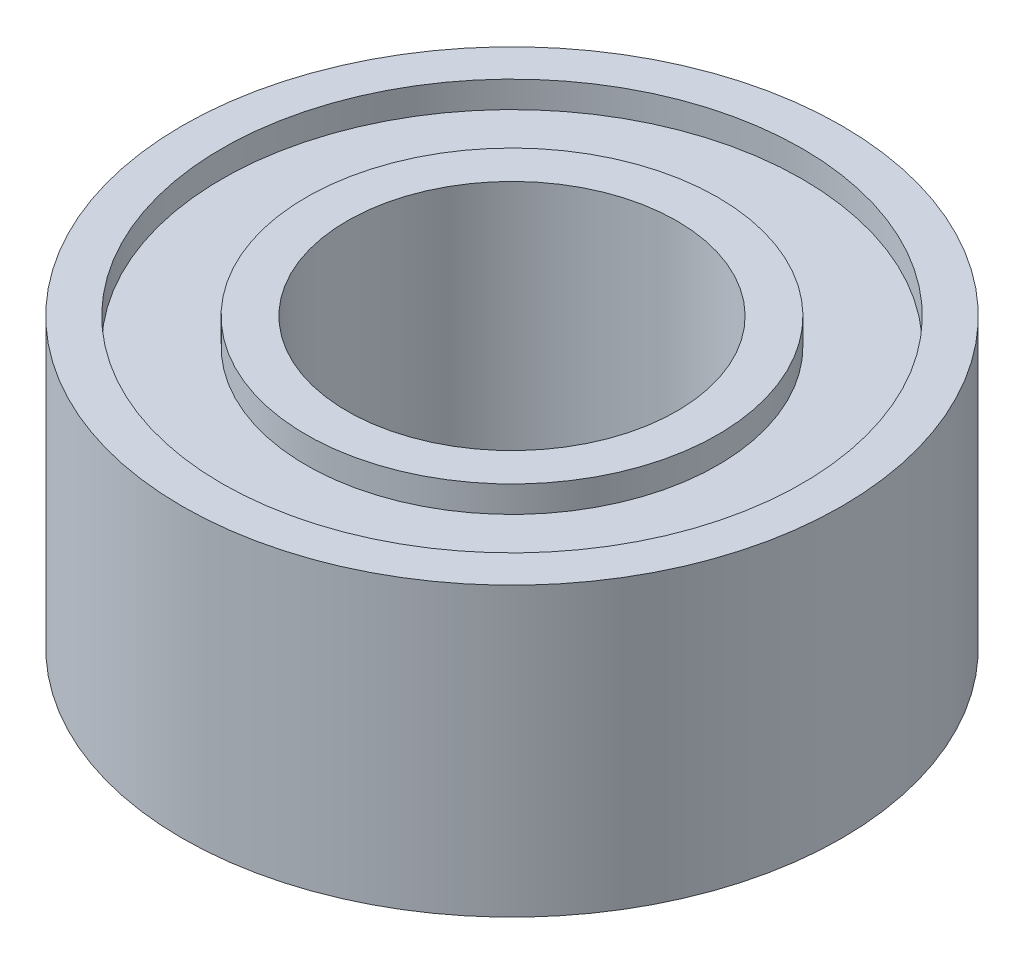
ISO-10303-21;
HEADER;
FILE_DESCRIPTION(('STEP AP214'),'2;1');
FILE_NAME('part.step','',(''),(''),'','','');
FILE_SCHEMA(('AUTOMOTIVE_DESIGN { 1 0 10303 214 1 1 1 1 }'));
ENDSEC;
DATA;
#1=APPLICATION_CONTEXT('core data for automotive mechanical design processes');
#2=APPLICATION_PROTOCOL_DEFINITION('international standard','automotive_design',2000,#1);
#3=PRODUCT_CONTEXT('',#1,'mechanical');
#4=PRODUCT('Part','Part','',(#3));
#5=PRODUCT_RELATED_PRODUCT_CATEGORY('part','',(#4));
#6=PRODUCT_DEFINITION_FORMATION('','',#4);
#7=PRODUCT_DEFINITION_CONTEXT('part definition',#1,'design');
#8=PRODUCT_DEFINITION('design','',#6,#7);
#9=PRODUCT_DEFINITION_SHAPE('','',#8);
#10=(LENGTH_UNIT() NAMED_UNIT(*) SI_UNIT(.MILLI.,.METRE.));
#11=(NAMED_UNIT(*) PLANE_ANGLE_UNIT() SI_UNIT($,.RADIAN.));
#12=(NAMED_UNIT(*) SI_UNIT($,.STERADIAN.) SOLID_ANGLE_UNIT());
#13=UNCERTAINTY_MEASURE_WITH_UNIT(LENGTH_MEASURE(1.E-05),#10,'distance_accuracy_value','');
#14=(GEOMETRIC_REPRESENTATION_CONTEXT(3) GLOBAL_UNCERTAINTY_ASSIGNED_CONTEXT((#13)) GLOBAL_UNIT_ASSIGNED_CONTEXT((#10,
#11,#12)) REPRESENTATION_CONTEXT('',''));
#15=CARTESIAN_POINT('',(0.,0.,0.));
#16=DIRECTION('',(0.,0.,1.));
#17=DIRECTION('',(1.,0.,0.));
#18=AXIS2_PLACEMENT_3D('',#15,#16,#17);
#19=CARTESIAN_POINT('',(0.,1.3843,0.));
#20=DIRECTION('',(0.,-1.,0.));
#21=DIRECTION('',(0.,0.,-1.));
#22=AXIS2_PLACEMENT_3D('',#19,#20,#21);
#23=CYLINDRICAL_SURFACE('',#22,1.9812);
#24=CARTESIAN_POINT('',(0.,1.3843,0.));
#25=DIRECTION('',(0.,-1.,0.));
#26=DIRECTION('',(0.,0.,-1.));
#27=AXIS2_PLACEMENT_3D('',#24,#25,#26);
#28=CIRCLE('',#27,1.9812);
#29=CARTESIAN_POINT('',(0.,1.3843,-1.9812));
#30=VERTEX_POINT('',#29);
#31=EDGE_CURVE('E10',#30,#30,#28,.T.);
#32=ORIENTED_EDGE('',*,*,#31,.T.);
#33=EDGE_LOOP('',(#32));
#34=FACE_BOUND('',#33,.T.);
#35=CARTESIAN_POINT('',(0.,1.1303,0.));
#36=DIRECTION('',(0.,-1.,0.));
#37=DIRECTION('',(0.,0.,-1.));
#38=AXIS2_PLACEMENT_3D('',#35,#36,#37);
#39=CIRCLE('',#38,1.9812);
#40=CARTESIAN_POINT('',(0.,1.1303,-1.9812));
#41=VERTEX_POINT('',#40);
#42=EDGE_CURVE('E70',#41,#41,#39,.T.);
#43=ORIENTED_EDGE('',*,*,#42,.F.);
#44=EDGE_LOOP('',(#43));
#45=FACE_BOUND('',#44,.T.);
#46=ADVANCED_FACE('F30',(#34,#45),#23,.T.);
#47=CARTESIAN_POINT('',(1.9812,1.3843,0.));
#48=DIRECTION('',(0.,1.,0.));
#49=DIRECTION('',(0.,0.,1.));
#50=AXIS2_PLACEMENT_3D('',#47,#48,#49);
#51=PLANE('',#50);
#52=CARTESIAN_POINT('',(0.,1.3843,0.));
#53=DIRECTION('',(0.,-1.,0.));
#54=DIRECTION('',(0.,0.,-1.));
#55=AXIS2_PLACEMENT_3D('',#52,#53,#54);
#56=CIRCLE('',#55,1.5875);
#57=CARTESIAN_POINT('',(0.,1.3843,-1.5875));
#58=VERTEX_POINT('',#57);
#59=EDGE_CURVE('E36',#58,#58,#56,.T.);
#60=ORIENTED_EDGE('',*,*,#59,.T.);
#61=EDGE_LOOP('',(#60));
#62=FACE_BOUND('',#61,.T.);
#63=ORIENTED_EDGE('',*,*,#31,.F.);
#64=EDGE_LOOP('',(#63));
#65=FACE_BOUND('',#64,.T.);
#66=ADVANCED_FACE('F78',(#62,#65),#51,.T.);
#67=CARTESIAN_POINT('',(0.,1.3843,0.));
#68=DIRECTION('',(0.,-1.,0.));
#69=DIRECTION('',(0.,0.,-1.));
#70=AXIS2_PLACEMENT_3D('',#67,#68,#69);
#71=CYLINDRICAL_SURFACE('',#70,1.5875);
#72=CARTESIAN_POINT('',(0.,-1.3843,0.));
#73=DIRECTION('',(0.,-1.,0.));
#74=DIRECTION('',(0.,0.,-1.));
#75=AXIS2_PLACEMENT_3D('',#72,#73,#74);
#76=CIRCLE('',#75,1.5875);
#77=CARTESIAN_POINT('',(0.,-1.3843,-1.5875));
#78=VERTEX_POINT('',#77);
#79=EDGE_CURVE('E40',#78,#78,#76,.T.);
#80=ORIENTED_EDGE('',*,*,#79,.T.);
#81=EDGE_LOOP('',(#80));
#82=FACE_BOUND('',#81,.T.);
#83=ORIENTED_EDGE('',*,*,#59,.F.);
#84=EDGE_LOOP('',(#83));
#85=FACE_BOUND('',#84,.T.);
#86=ADVANCED_FACE('F82',(#82,#85),#71,.F.);
#87=CARTESIAN_POINT('',(1.5875,-1.3843,0.));
#88=DIRECTION('',(0.,-1.,0.));
#89=DIRECTION('',(0.,0.,-1.));
#90=AXIS2_PLACEMENT_3D('',#87,#88,#89);
#91=PLANE('',#90);
#92=CARTESIAN_POINT('',(0.,-1.3843,0.));
#93=DIRECTION('',(0.,-1.,0.));
#94=DIRECTION('',(0.,0.,-1.));
#95=AXIS2_PLACEMENT_3D('',#92,#93,#94);
#96=CIRCLE('',#95,1.9812);
#97=CARTESIAN_POINT('',(0.,-1.3843,-1.9812));
#98=VERTEX_POINT('',#97);
#99=EDGE_CURVE('E44',#98,#98,#96,.T.);
#100=ORIENTED_EDGE('',*,*,#99,.T.);
#101=EDGE_LOOP('',(#100));
#102=FACE_BOUND('',#101,.T.);
#103=ORIENTED_EDGE('',*,*,#79,.F.);
#104=EDGE_LOOP('',(#103));
#105=FACE_BOUND('',#104,.T.);
#106=ADVANCED_FACE('F86',(#102,#105),#91,.T.);
#107=CARTESIAN_POINT('',(0.,1.3843,0.));
#108=DIRECTION('',(0.,-1.,0.));
#109=DIRECTION('',(0.,0.,-1.));
#110=AXIS2_PLACEMENT_3D('',#107,#108,#109);
#111=CYLINDRICAL_SURFACE('',#110,1.9812);
#112=CARTESIAN_POINT('',(0.,-1.1303,0.));
#113=DIRECTION('',(0.,-1.,0.));
#114=DIRECTION('',(0.,0.,-1.));
#115=AXIS2_PLACEMENT_3D('',#112,#113,#114);
#116=CIRCLE('',#115,1.9812);
#117=CARTESIAN_POINT('',(0.,-1.1303,-1.9812));
#118=VERTEX_POINT('',#117);
#119=EDGE_CURVE('E49',#118,#118,#116,.T.);
#120=ORIENTED_EDGE('',*,*,#119,.T.);
#121=EDGE_LOOP('',(#120));
#122=FACE_BOUND('',#121,.T.);
#123=ORIENTED_EDGE('',*,*,#99,.F.);
#124=EDGE_LOOP('',(#123));
#125=FACE_BOUND('',#124,.T.);
#126=ADVANCED_FACE('F93',(#122,#125),#111,.T.);
#127=CARTESIAN_POINT('',(1.9812,-1.1303,0.));
#128=DIRECTION('',(0.,-1.,0.));
#129=DIRECTION('',(0.,0.,-1.));
#130=AXIS2_PLACEMENT_3D('',#127,#128,#129);
#131=PLANE('',#130);
#132=CARTESIAN_POINT('',(0.,-1.1303,0.));
#133=DIRECTION('',(0.,-1.,0.));
#134=DIRECTION('',(0.,0.,-1.));
#135=AXIS2_PLACEMENT_3D('',#132,#133,#134);
#136=CIRCLE('',#135,2.794);
#137=CARTESIAN_POINT('',(0.,-1.1303,-2.794));
#138=VERTEX_POINT('',#137);
#139=EDGE_CURVE('E52',#138,#138,#136,.T.);
#140=ORIENTED_EDGE('',*,*,#139,.T.);
#141=EDGE_LOOP('',(#140));
#142=FACE_BOUND('',#141,.T.);
#143=ORIENTED_EDGE('',*,*,#119,.F.);
#144=EDGE_LOOP('',(#143));
#145=FACE_BOUND('',#144,.T.);
#146=ADVANCED_FACE('F97',(#142,#145),#131,.T.);
#147=CARTESIAN_POINT('',(0.,1.3843,0.));
#148=DIRECTION('',(0.,-1.,0.));
#149=DIRECTION('',(0.,0.,-1.));
#150=AXIS2_PLACEMENT_3D('',#147,#148,#149);
#151=CYLINDRICAL_SURFACE('',#150,2.794);
#152=CARTESIAN_POINT('',(0.,-1.3843,0.));
#153=DIRECTION('',(0.,-1.,0.));
#154=DIRECTION('',(0.,0.,-1.));
#155=AXIS2_PLACEMENT_3D('',#152,#153,#154);
#156=CIRCLE('',#155,2.794);
#157=CARTESIAN_POINT('',(0.,-1.3843,-2.794));
#158=VERTEX_POINT('',#157);
#159=EDGE_CURVE('E55',#158,#158,#156,.T.);
#160=ORIENTED_EDGE('',*,*,#159,.T.);
#161=EDGE_LOOP('',(#160));
#162=FACE_BOUND('',#161,.T.);
#163=ORIENTED_EDGE('',*,*,#139,.F.);
#164=EDGE_LOOP('',(#163));
#165=FACE_BOUND('',#164,.T.);
#166=ADVANCED_FACE('F101',(#162,#165),#151,.F.);
#167=CARTESIAN_POINT('',(2.794,-1.3843,0.));
#168=DIRECTION('',(0.,-1.,0.));
#169=DIRECTION('',(0.,0.,-1.));
#170=AXIS2_PLACEMENT_3D('',#167,#168,#169);
#171=PLANE('',#170);
#172=CARTESIAN_POINT('',(0.,-1.3843,0.));
#173=DIRECTION('',(0.,-1.,0.));
#174=DIRECTION('',(0.,0.,-1.));
#175=AXIS2_PLACEMENT_3D('',#172,#173,#174);
#176=CIRCLE('',#175,3.175);
#177=CARTESIAN_POINT('',(0.,-1.3843,-3.175));
#178=VERTEX_POINT('',#177);
#179=EDGE_CURVE('E58',#178,#178,#176,.T.);
#180=ORIENTED_EDGE('',*,*,#179,.T.);
#181=EDGE_LOOP('',(#180));
#182=FACE_BOUND('',#181,.T.);
#183=ORIENTED_EDGE('',*,*,#159,.F.);
#184=EDGE_LOOP('',(#183));
#185=FACE_BOUND('',#184,.T.);
#186=ADVANCED_FACE('F105',(#182,#185),#171,.T.);
#187=CARTESIAN_POINT('',(0.,1.3843,0.));
#188=DIRECTION('',(0.,-1.,0.));
#189=DIRECTION('',(0.,0.,-1.));
#190=AXIS2_PLACEMENT_3D('',#187,#188,#189);
#191=CYLINDRICAL_SURFACE('',#190,3.175);
#192=CARTESIAN_POINT('',(0.,1.3843,0.));
#193=DIRECTION('',(0.,-1.,0.));
#194=DIRECTION('',(0.,0.,-1.));
#195=AXIS2_PLACEMENT_3D('',#192,#193,#194);
#196=CIRCLE('',#195,3.175);
#197=CARTESIAN_POINT('',(0.,1.3843,-3.175));
#198=VERTEX_POINT('',#197);
#199=EDGE_CURVE('E61',#198,#198,#196,.T.);
#200=ORIENTED_EDGE('',*,*,#199,.T.);
#201=EDGE_LOOP('',(#200));
#202=FACE_BOUND('',#201,.T.);
#203=ORIENTED_EDGE('',*,*,#179,.F.);
#204=EDGE_LOOP('',(#203));
#205=FACE_BOUND('',#204,.T.);
#206=ADVANCED_FACE('F109',(#202,#205),#191,.T.);
#207=CARTESIAN_POINT('',(3.175,1.3843,0.));
#208=DIRECTION('',(0.,1.,0.));
#209=DIRECTION('',(0.,0.,1.));
#210=AXIS2_PLACEMENT_3D('',#207,#208,#209);
#211=PLANE('',#210);
#212=CARTESIAN_POINT('',(0.,1.3843,0.));
#213=DIRECTION('',(0.,-1.,0.));
#214=DIRECTION('',(0.,0.,-1.));
#215=AXIS2_PLACEMENT_3D('',#212,#213,#214);
#216=CIRCLE('',#215,2.794);
#217=CARTESIAN_POINT('',(0.,1.3843,-2.794));
#218=VERTEX_POINT('',#217);
#219=EDGE_CURVE('E64',#218,#218,#216,.T.);
#220=ORIENTED_EDGE('',*,*,#219,.T.);
#221=EDGE_LOOP('',(#220));
#222=FACE_BOUND('',#221,.T.);
#223=ORIENTED_EDGE('',*,*,#199,.F.);
#224=EDGE_LOOP('',(#223));
#225=FACE_BOUND('',#224,.T.);
#226=ADVANCED_FACE('F113',(#222,#225),#211,.T.);
#227=CARTESIAN_POINT('',(0.,1.3843,0.));
#228=DIRECTION('',(0.,-1.,0.));
#229=DIRECTION('',(0.,0.,-1.));
#230=AXIS2_PLACEMENT_3D('',#227,#228,#229);
#231=CYLINDRICAL_SURFACE('',#230,2.794);
#232=CARTESIAN_POINT('',(0.,1.1303,0.));
#233=DIRECTION('',(0.,-1.,0.));
#234=DIRECTION('',(0.,0.,-1.));
#235=AXIS2_PLACEMENT_3D('',#232,#233,#234);
#236=CIRCLE('',#235,2.794);
#237=CARTESIAN_POINT('',(0.,1.1303,-2.794));
#238=VERTEX_POINT('',#237);
#239=EDGE_CURVE('E67',#238,#238,#236,.T.);
#240=ORIENTED_EDGE('',*,*,#239,.T.);
#241=EDGE_LOOP('',(#240));
#242=FACE_BOUND('',#241,.T.);
#243=ORIENTED_EDGE('',*,*,#219,.F.);
#244=EDGE_LOOP('',(#243));
#245=FACE_BOUND('',#244,.T.);
#246=ADVANCED_FACE('F117',(#242,#245),#231,.F.);
#247=CARTESIAN_POINT('',(2.794,1.1303,0.));
#248=DIRECTION('',(0.,1.,0.));
#249=DIRECTION('',(0.,0.,1.));
#250=AXIS2_PLACEMENT_3D('',#247,#248,#249);
#251=PLANE('',#250);
#252=ORIENTED_EDGE('',*,*,#42,.T.);
#253=EDGE_LOOP('',(#252));
#254=FACE_BOUND('',#253,.T.);
#255=ORIENTED_EDGE('',*,*,#239,.F.);
#256=EDGE_LOOP('',(#255));
#257=FACE_BOUND('',#256,.T.);
#258=ADVANCED_FACE('F74',(#254,#257),#251,.T.);
#259=CLOSED_SHELL('',(#46,#66,#86,#106,#126,#146,#166,#186,#206,#226,#246,#258));
#260=MANIFOLD_SOLID_BREP('B2',#259);
#261=ADVANCED_BREP_SHAPE_REPRESENTATION('',(#18,#260),#14);
#262=SHAPE_DEFINITION_REPRESENTATION(#9,#261);
ENDSEC;
END-ISO-10303-21;
